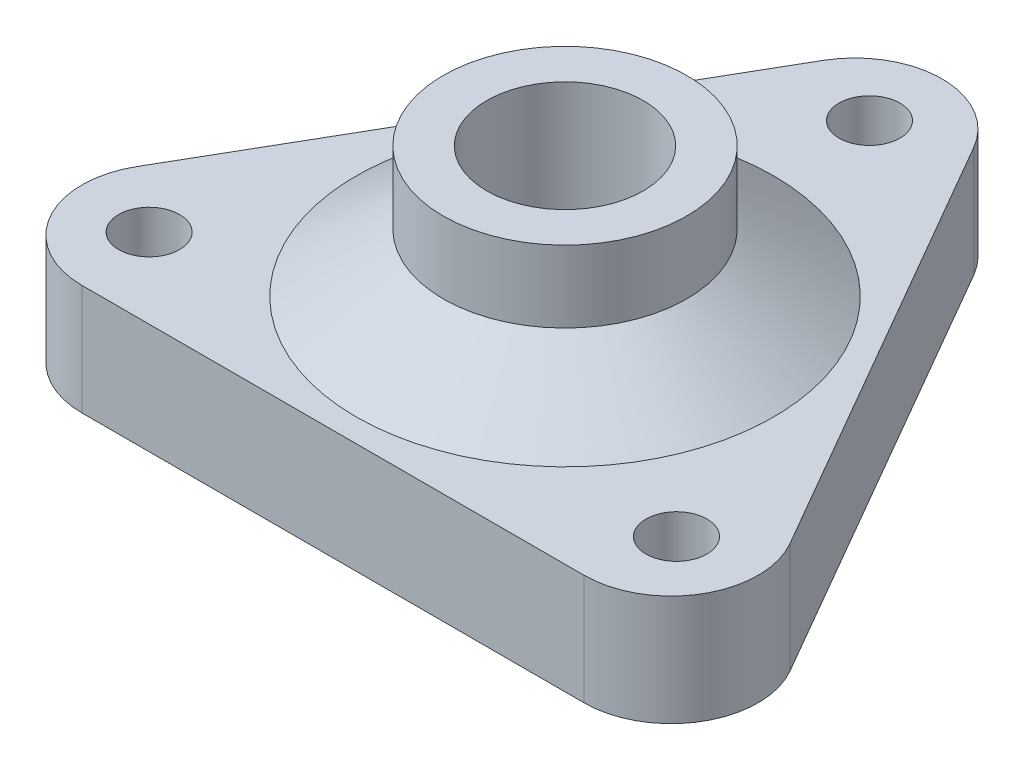
ISO-10303-21;
HEADER;
FILE_DESCRIPTION(('STEP AP214'),'2;1');
FILE_NAME('part.step','',(''),(''),'','','');
FILE_SCHEMA(('AUTOMOTIVE_DESIGN { 1 0 10303 214 1 1 1 1 }'));
ENDSEC;
DATA;
#1=APPLICATION_CONTEXT('core data for automotive mechanical design processes');
#2=APPLICATION_PROTOCOL_DEFINITION('international standard','automotive_design',2000,#1);
#3=PRODUCT_CONTEXT('',#1,'mechanical');
#4=PRODUCT('Part','Part','',(#3));
#5=PRODUCT_RELATED_PRODUCT_CATEGORY('part','',(#4));
#6=PRODUCT_DEFINITION_FORMATION('','',#4);
#7=PRODUCT_DEFINITION_CONTEXT('part definition',#1,'design');
#8=PRODUCT_DEFINITION('design','',#6,#7);
#9=PRODUCT_DEFINITION_SHAPE('','',#8);
#10=(LENGTH_UNIT() NAMED_UNIT(*) SI_UNIT(.MILLI.,.METRE.));
#11=(NAMED_UNIT(*) PLANE_ANGLE_UNIT() SI_UNIT($,.RADIAN.));
#12=(NAMED_UNIT(*) SI_UNIT($,.STERADIAN.) SOLID_ANGLE_UNIT());
#13=UNCERTAINTY_MEASURE_WITH_UNIT(LENGTH_MEASURE(1.E-05),#10,'distance_accuracy_value','');
#14=(GEOMETRIC_REPRESENTATION_CONTEXT(3) GLOBAL_UNCERTAINTY_ASSIGNED_CONTEXT((#13)) GLOBAL_UNIT_ASSIGNED_CONTEXT((#10,
#11,#12)) REPRESENTATION_CONTEXT('',''));
#15=CARTESIAN_POINT('',(0.,0.,0.));
#16=DIRECTION('',(0.,0.,1.));
#17=DIRECTION('',(1.,0.,0.));
#18=AXIS2_PLACEMENT_3D('',#15,#16,#17);
#19=CARTESIAN_POINT('',(0.,6.35,0.));
#20=DIRECTION('',(0.,1.,0.));
#21=DIRECTION('',(0.,0.,1.));
#22=AXIS2_PLACEMENT_3D('',#19,#20,#21);
#23=PLANE('',#22);
#24=CARTESIAN_POINT('',(0.,6.35,0.));
#25=DIRECTION('',(0.,1.,0.));
#26=DIRECTION('',(0.,0.,1.));
#27=AXIS2_PLACEMENT_3D('',#24,#25,#26);
#28=CIRCLE('',#27,12.);
#29=CARTESIAN_POINT('',(0.,6.35,12.));
#30=VERTEX_POINT('',#29);
#31=EDGE_CURVE('E11',#30,#30,#28,.F.);
#32=ORIENTED_EDGE('',*,*,#31,.T.);
#33=EDGE_LOOP('',(#32));
#34=FACE_BOUND('',#33,.T.);
#35=DIRECTION('',(-0.5,0.,-0.866025403784439));
#36=VECTOR('',#35,1.);
#37=CARTESIAN_POINT('',(11.5470053837925,6.35,-6.66666666666666));
#38=LINE('',#37,#36);
#39=CARTESIAN_POINT('',(18.7638837486628,6.35,5.83333333333334));
#40=VERTEX_POINT('',#39);
#41=CARTESIAN_POINT('',(4.33012701892218,6.35,-19.1666666666667));
#42=VERTEX_POINT('',#41);
#43=EDGE_CURVE('E249',#40,#42,#38,.T.);
#44=ORIENTED_EDGE('',*,*,#43,.T.);
#45=CARTESIAN_POINT('',(0.,6.35,-16.6666666666667));
#46=DIRECTION('',(0.,1.,0.));
#47=DIRECTION('',(0.,0.,1.));
#48=AXIS2_PLACEMENT_3D('',#45,#46,#47);
#49=CIRCLE('',#48,5.);
#50=CARTESIAN_POINT('',(-4.3301270189222,6.35,-19.1666666666667));
#51=VERTEX_POINT('',#50);
#52=EDGE_CURVE('E156',#42,#51,#49,.T.);
#53=ORIENTED_EDGE('',*,*,#52,.T.);
#54=DIRECTION('',(-0.5,0.,0.866025403784439));
#55=VECTOR('',#54,1.);
#56=CARTESIAN_POINT('',(-11.5470053837925,6.35,-6.66666666666667));
#57=LINE('',#56,#55);
#58=CARTESIAN_POINT('',(-18.7638837486628,6.35,5.83333333333333));
#59=VERTEX_POINT('',#58);
#60=EDGE_CURVE('E120',#51,#59,#57,.T.);
#61=ORIENTED_EDGE('',*,*,#60,.T.);
#62=CARTESIAN_POINT('',(-14.4337567297406,6.35,8.33333333333333));
#63=DIRECTION('',(0.,1.,0.));
#64=DIRECTION('',(0.,0.,1.));
#65=AXIS2_PLACEMENT_3D('',#62,#63,#64);
#66=CIRCLE('',#65,5.);
#67=CARTESIAN_POINT('',(-14.4337567297406,6.35,13.3333333333333));
#68=VERTEX_POINT('',#67);
#69=EDGE_CURVE('E67',#59,#68,#66,.T.);
#70=ORIENTED_EDGE('',*,*,#69,.T.);
#71=DIRECTION('',(1.,0.,0.));
#72=VECTOR('',#71,1.);
#73=CARTESIAN_POINT('',(0.,6.35,13.3333333333333));
#74=LINE('',#73,#72);
#75=CARTESIAN_POINT('',(14.4337567297406,6.35,13.3333333333333));
#76=VERTEX_POINT('',#75);
#77=EDGE_CURVE('E227',#68,#76,#74,.T.);
#78=ORIENTED_EDGE('',*,*,#77,.T.);
#79=CARTESIAN_POINT('',(14.4337567297406,6.35,8.33333333333333));
#80=DIRECTION('',(0.,1.,0.));
#81=DIRECTION('',(0.,0.,1.));
#82=AXIS2_PLACEMENT_3D('',#79,#80,#81);
#83=CIRCLE('',#82,5.);
#84=EDGE_CURVE('E153',#76,#40,#83,.T.);
#85=ORIENTED_EDGE('',*,*,#84,.T.);
#86=EDGE_LOOP('',(#44,#53,#61,#70,#78,#85));
#87=FACE_BOUND('',#86,.T.);
#88=CARTESIAN_POINT('',(-15.1554445662277,6.35,8.75));
#89=DIRECTION('',(0.,1.,0.));
#90=DIRECTION('',(0.,0.,1.));
#91=AXIS2_PLACEMENT_3D('',#88,#89,#90);
#92=CIRCLE('',#91,1.75);
#93=CARTESIAN_POINT('',(-15.1554445662277,6.35,10.5));
#94=VERTEX_POINT('',#93);
#95=EDGE_CURVE('E255',#94,#94,#92,.T.);
#96=ORIENTED_EDGE('',*,*,#95,.F.);
#97=EDGE_LOOP('',(#96));
#98=FACE_BOUND('',#97,.T.);
#99=CARTESIAN_POINT('',(0.,6.35,-17.5));
#100=DIRECTION('',(0.,1.,0.));
#101=DIRECTION('',(0.,0.,1.));
#102=AXIS2_PLACEMENT_3D('',#99,#100,#101);
#103=CIRCLE('',#102,1.75);
#104=CARTESIAN_POINT('',(0.,6.35,-15.75));
#105=VERTEX_POINT('',#104);
#106=EDGE_CURVE('E134',#105,#105,#103,.T.);
#107=ORIENTED_EDGE('',*,*,#106,.F.);
#108=EDGE_LOOP('',(#107));
#109=FACE_BOUND('',#108,.T.);
#110=CARTESIAN_POINT('',(15.1554445662277,6.35,8.75));
#111=DIRECTION('',(0.,1.,0.));
#112=DIRECTION('',(0.,0.,1.));
#113=AXIS2_PLACEMENT_3D('',#110,#111,#112);
#114=CIRCLE('',#113,1.75);
#115=CARTESIAN_POINT('',(15.1554445662277,6.35,10.5));
#116=VERTEX_POINT('',#115);
#117=EDGE_CURVE('E128',#116,#116,#114,.T.);
#118=ORIENTED_EDGE('',*,*,#117,.F.);
#119=EDGE_LOOP('',(#118));
#120=FACE_BOUND('',#119,.T.);
#121=ADVANCED_FACE('F43',(#34,#87,#98,#109,#120),#23,.T.);
#122=CARTESIAN_POINT('',(0.,6.35,13.3333333333333));
#123=DIRECTION('',(0.,0.,-1.));
#124=DIRECTION('',(-1.,0.,0.));
#125=AXIS2_PLACEMENT_3D('',#122,#123,#124);
#126=PLANE('',#125);
#127=DIRECTION('',(1.,0.,0.));
#128=VECTOR('',#127,1.);
#129=CARTESIAN_POINT('',(0.,0.,13.3333333333333));
#130=LINE('',#129,#128);
#131=CARTESIAN_POINT('',(-14.4337567297406,0.,13.3333333333333));
#132=VERTEX_POINT('',#131);
#133=CARTESIAN_POINT('',(14.4337567297406,0.,13.3333333333333));
#134=VERTEX_POINT('',#133);
#135=EDGE_CURVE('E136',#132,#134,#130,.T.);
#136=ORIENTED_EDGE('',*,*,#135,.T.);
#137=DIRECTION('',(0.,-1.,0.));
#138=VECTOR('',#137,1.);
#139=CARTESIAN_POINT('',(14.4337567297406,6.35,13.3333333333333));
#140=LINE('',#139,#138);
#141=EDGE_CURVE('E60',#134,#76,#140,.F.);
#142=ORIENTED_EDGE('',*,*,#141,.T.);
#143=ORIENTED_EDGE('',*,*,#77,.F.);
#144=DIRECTION('',(0.,-1.,0.));
#145=VECTOR('',#144,1.);
#146=CARTESIAN_POINT('',(-14.4337567297406,6.35,13.3333333333333));
#147=LINE('',#146,#145);
#148=EDGE_CURVE('E159',#68,#132,#147,.T.);
#149=ORIENTED_EDGE('',*,*,#148,.T.);
#150=EDGE_LOOP('',(#136,#142,#143,#149));
#151=FACE_BOUND('',#150,.T.);
#152=ADVANCED_FACE('F180',(#151),#126,.F.);
#153=CARTESIAN_POINT('',(11.5470053837925,6.35,-6.66666666666666));
#154=DIRECTION('',(-0.866025403784439,0.,0.5));
#155=DIRECTION('',(0.5,0.,0.866025403784439));
#156=AXIS2_PLACEMENT_3D('',#153,#154,#155);
#157=PLANE('',#156);
#158=DIRECTION('',(-0.5,0.,-0.866025403784439));
#159=VECTOR('',#158,1.);
#160=CARTESIAN_POINT('',(11.5470053837925,0.,-6.66666666666666));
#161=LINE('',#160,#159);
#162=CARTESIAN_POINT('',(18.7638837486628,0.,5.83333333333334));
#163=VERTEX_POINT('',#162);
#164=CARTESIAN_POINT('',(4.33012701892218,0.,-19.1666666666667));
#165=VERTEX_POINT('',#164);
#166=EDGE_CURVE('E129',#163,#165,#161,.T.);
#167=ORIENTED_EDGE('',*,*,#166,.T.);
#168=DIRECTION('',(0.,-1.,0.));
#169=VECTOR('',#168,1.);
#170=CARTESIAN_POINT('',(4.33012701892219,6.35,-19.1666666666667));
#171=LINE('',#170,#169);
#172=EDGE_CURVE('E105',#165,#42,#171,.F.);
#173=ORIENTED_EDGE('',*,*,#172,.T.);
#174=ORIENTED_EDGE('',*,*,#43,.F.);
#175=DIRECTION('',(0.,-1.,0.));
#176=VECTOR('',#175,1.);
#177=CARTESIAN_POINT('',(18.7638837486628,6.35,5.83333333333333));
#178=LINE('',#177,#176);
#179=EDGE_CURVE('E111',#40,#163,#178,.T.);
#180=ORIENTED_EDGE('',*,*,#179,.T.);
#181=EDGE_LOOP('',(#167,#173,#174,#180));
#182=FACE_BOUND('',#181,.T.);
#183=ADVANCED_FACE('F186',(#182),#157,.F.);
#184=CARTESIAN_POINT('',(0.,6.35,0.));
#185=DIRECTION('',(0.,-1.,0.));
#186=DIRECTION('',(0.,0.,-1.));
#187=AXIS2_PLACEMENT_3D('',#184,#185,#186);
#188=CYLINDRICAL_SURFACE('',#187,4.5);
#189=CARTESIAN_POINT('',(0.,0.,0.));
#190=DIRECTION('',(0.,1.,0.));
#191=DIRECTION('',(0.,0.,1.));
#192=AXIS2_PLACEMENT_3D('',#189,#190,#191);
#193=CIRCLE('',#192,4.5);
#194=CARTESIAN_POINT('',(0.,0.,4.5));
#195=VERTEX_POINT('',#194);
#196=EDGE_CURVE('E229',#195,#195,#193,.T.);
#197=ORIENTED_EDGE('',*,*,#196,.F.);
#198=EDGE_LOOP('',(#197));
#199=FACE_BOUND('',#198,.T.);
#200=CARTESIAN_POINT('',(0.,13.85,0.));
#201=DIRECTION('',(0.,1.,0.));
#202=DIRECTION('',(0.,0.,1.));
#203=AXIS2_PLACEMENT_3D('',#200,#201,#202);
#204=CIRCLE('',#203,4.5);
#205=CARTESIAN_POINT('',(0.,13.85,4.5));
#206=VERTEX_POINT('',#205);
#207=EDGE_CURVE('E265',#206,#206,#204,.T.);
#208=ORIENTED_EDGE('',*,*,#207,.T.);
#209=EDGE_LOOP('',(#208));
#210=FACE_BOUND('',#209,.T.);
#211=ADVANCED_FACE('F197',(#199,#210),#188,.F.);
#212=CARTESIAN_POINT('',(-15.1554445662277,6.35,8.75));
#213=DIRECTION('',(0.,-1.,0.));
#214=DIRECTION('',(0.,0.,-1.));
#215=AXIS2_PLACEMENT_3D('',#212,#213,#214);
#216=CYLINDRICAL_SURFACE('',#215,1.75);
#217=ORIENTED_EDGE('',*,*,#95,.T.);
#218=EDGE_LOOP('',(#217));
#219=FACE_BOUND('',#218,.T.);
#220=CARTESIAN_POINT('',(-15.1554445662277,0.,8.75));
#221=DIRECTION('',(0.,1.,0.));
#222=DIRECTION('',(0.,0.,1.));
#223=AXIS2_PLACEMENT_3D('',#220,#221,#222);
#224=CIRCLE('',#223,1.75);
#225=CARTESIAN_POINT('',(-15.1554445662277,0.,10.5));
#226=VERTEX_POINT('',#225);
#227=EDGE_CURVE('E232',#226,#226,#224,.T.);
#228=ORIENTED_EDGE('',*,*,#227,.F.);
#229=EDGE_LOOP('',(#228));
#230=FACE_BOUND('',#229,.T.);
#231=ADVANCED_FACE('F202',(#219,#230),#216,.F.);
#232=CARTESIAN_POINT('',(0.,6.35,-17.5));
#233=DIRECTION('',(0.,-1.,0.));
#234=DIRECTION('',(0.,0.,-1.));
#235=AXIS2_PLACEMENT_3D('',#232,#233,#234);
#236=CYLINDRICAL_SURFACE('',#235,1.75);
#237=ORIENTED_EDGE('',*,*,#106,.T.);
#238=EDGE_LOOP('',(#237));
#239=FACE_BOUND('',#238,.T.);
#240=CARTESIAN_POINT('',(0.,0.,-17.5));
#241=DIRECTION('',(0.,1.,0.));
#242=DIRECTION('',(0.,0.,1.));
#243=AXIS2_PLACEMENT_3D('',#240,#241,#242);
#244=CIRCLE('',#243,1.75);
#245=CARTESIAN_POINT('',(0.,0.,-15.75));
#246=VERTEX_POINT('',#245);
#247=EDGE_CURVE('E238',#246,#246,#244,.T.);
#248=ORIENTED_EDGE('',*,*,#247,.F.);
#249=EDGE_LOOP('',(#248));
#250=FACE_BOUND('',#249,.T.);
#251=ADVANCED_FACE('F206',(#239,#250),#236,.F.);
#252=CARTESIAN_POINT('',(15.1554445662277,6.35,8.75));
#253=DIRECTION('',(0.,-1.,0.));
#254=DIRECTION('',(0.,0.,-1.));
#255=AXIS2_PLACEMENT_3D('',#252,#253,#254);
#256=CYLINDRICAL_SURFACE('',#255,1.75);
#257=ORIENTED_EDGE('',*,*,#117,.T.);
#258=EDGE_LOOP('',(#257));
#259=FACE_BOUND('',#258,.T.);
#260=CARTESIAN_POINT('',(15.1554445662277,0.,8.75));
#261=DIRECTION('',(0.,1.,0.));
#262=DIRECTION('',(0.,0.,1.));
#263=AXIS2_PLACEMENT_3D('',#260,#261,#262);
#264=CIRCLE('',#263,1.75);
#265=CARTESIAN_POINT('',(15.1554445662277,0.,10.5));
#266=VERTEX_POINT('',#265);
#267=EDGE_CURVE('E242',#266,#266,#264,.T.);
#268=ORIENTED_EDGE('',*,*,#267,.F.);
#269=EDGE_LOOP('',(#268));
#270=FACE_BOUND('',#269,.T.);
#271=ADVANCED_FACE('F195',(#259,#270),#256,.F.);
#272=CARTESIAN_POINT('',(-11.5470053837925,6.35,-6.66666666666667));
#273=DIRECTION('',(0.866025403784439,0.,0.5));
#274=DIRECTION('',(0.5,0.,-0.866025403784439));
#275=AXIS2_PLACEMENT_3D('',#272,#273,#274);
#276=PLANE('',#275);
#277=ORIENTED_EDGE('',*,*,#60,.F.);
#278=DIRECTION('',(0.,-1.,0.));
#279=VECTOR('',#278,1.);
#280=CARTESIAN_POINT('',(-4.3301270189222,6.35,-19.1666666666667));
#281=LINE('',#280,#279);
#282=CARTESIAN_POINT('',(-4.3301270189222,0.,-19.1666666666667));
#283=VERTEX_POINT('',#282);
#284=EDGE_CURVE('E104',#51,#283,#281,.T.);
#285=ORIENTED_EDGE('',*,*,#284,.T.);
#286=DIRECTION('',(-0.5,0.,0.866025403784439));
#287=VECTOR('',#286,1.);
#288=CARTESIAN_POINT('',(-11.5470053837925,0.,-6.66666666666667));
#289=LINE('',#288,#287);
#290=CARTESIAN_POINT('',(-18.7638837486628,0.,5.83333333333333));
#291=VERTEX_POINT('',#290);
#292=EDGE_CURVE('E118',#283,#291,#289,.T.);
#293=ORIENTED_EDGE('',*,*,#292,.T.);
#294=DIRECTION('',(0.,-1.,0.));
#295=VECTOR('',#294,1.);
#296=CARTESIAN_POINT('',(-18.7638837486628,6.35,5.83333333333333));
#297=LINE('',#296,#295);
#298=EDGE_CURVE('E123',#291,#59,#297,.F.);
#299=ORIENTED_EDGE('',*,*,#298,.T.);
#300=EDGE_LOOP('',(#277,#285,#293,#299));
#301=FACE_BOUND('',#300,.T.);
#302=ADVANCED_FACE('F117',(#301),#276,.F.);
#303=CARTESIAN_POINT('',(0.,0.,0.));
#304=DIRECTION('',(0.,1.,0.));
#305=DIRECTION('',(0.,0.,1.));
#306=AXIS2_PLACEMENT_3D('',#303,#304,#305);
#307=PLANE('',#306);
#308=ORIENTED_EDGE('',*,*,#267,.T.);
#309=EDGE_LOOP('',(#308));
#310=FACE_BOUND('',#309,.T.);
#311=ORIENTED_EDGE('',*,*,#247,.T.);
#312=EDGE_LOOP('',(#311));
#313=FACE_BOUND('',#312,.T.);
#314=ORIENTED_EDGE('',*,*,#227,.T.);
#315=EDGE_LOOP('',(#314));
#316=FACE_BOUND('',#315,.T.);
#317=ORIENTED_EDGE('',*,*,#196,.T.);
#318=EDGE_LOOP('',(#317));
#319=FACE_BOUND('',#318,.T.);
#320=ORIENTED_EDGE('',*,*,#292,.F.);
#321=CARTESIAN_POINT('',(0.,0.,-16.6666666666667));
#322=DIRECTION('',(0.,1.,0.));
#323=DIRECTION('',(0.,0.,1.));
#324=AXIS2_PLACEMENT_3D('',#321,#322,#323);
#325=CIRCLE('',#324,5.);
#326=EDGE_CURVE('E100',#283,#165,#325,.F.);
#327=ORIENTED_EDGE('',*,*,#326,.T.);
#328=ORIENTED_EDGE('',*,*,#166,.F.);
#329=CARTESIAN_POINT('',(14.4337567297406,0.,8.33333333333333));
#330=DIRECTION('',(0.,1.,0.));
#331=DIRECTION('',(0.,0.,1.));
#332=AXIS2_PLACEMENT_3D('',#329,#330,#331);
#333=CIRCLE('',#332,5.);
#334=EDGE_CURVE('E112',#163,#134,#333,.F.);
#335=ORIENTED_EDGE('',*,*,#334,.T.);
#336=ORIENTED_EDGE('',*,*,#135,.F.);
#337=CARTESIAN_POINT('',(-14.4337567297406,0.,8.33333333333333));
#338=DIRECTION('',(0.,1.,0.));
#339=DIRECTION('',(0.,0.,1.));
#340=AXIS2_PLACEMENT_3D('',#337,#338,#339);
#341=CIRCLE('',#340,5.);
#342=EDGE_CURVE('E122',#132,#291,#341,.F.);
#343=ORIENTED_EDGE('',*,*,#342,.T.);
#344=EDGE_LOOP('',(#320,#327,#328,#335,#336,#343));
#345=FACE_BOUND('',#344,.T.);
#346=ADVANCED_FACE('F125',(#310,#313,#316,#319,#345),#307,.F.);
#347=CARTESIAN_POINT('',(0.,6.35,-16.6666666666667));
#348=DIRECTION('',(0.,-1.,0.));
#349=DIRECTION('',(0.,0.,-1.));
#350=AXIS2_PLACEMENT_3D('',#347,#348,#349);
#351=CYLINDRICAL_SURFACE('',#350,5.);
#352=ORIENTED_EDGE('',*,*,#52,.F.);
#353=ORIENTED_EDGE('',*,*,#172,.F.);
#354=ORIENTED_EDGE('',*,*,#326,.F.);
#355=ORIENTED_EDGE('',*,*,#284,.F.);
#356=EDGE_LOOP('',(#352,#353,#354,#355));
#357=FACE_BOUND('',#356,.T.);
#358=ADVANCED_FACE('F103',(#357),#351,.T.);
#359=CARTESIAN_POINT('',(14.4337567297406,6.35,8.33333333333333));
#360=DIRECTION('',(0.,-1.,0.));
#361=DIRECTION('',(0.,0.,-1.));
#362=AXIS2_PLACEMENT_3D('',#359,#360,#361);
#363=CYLINDRICAL_SURFACE('',#362,5.);
#364=ORIENTED_EDGE('',*,*,#84,.F.);
#365=ORIENTED_EDGE('',*,*,#141,.F.);
#366=ORIENTED_EDGE('',*,*,#334,.F.);
#367=ORIENTED_EDGE('',*,*,#179,.F.);
#368=EDGE_LOOP('',(#364,#365,#366,#367));
#369=FACE_BOUND('',#368,.T.);
#370=ADVANCED_FACE('F216',(#369),#363,.T.);
#371=CARTESIAN_POINT('',(-14.4337567297406,6.35,8.33333333333333));
#372=DIRECTION('',(0.,-1.,0.));
#373=DIRECTION('',(0.,0.,-1.));
#374=AXIS2_PLACEMENT_3D('',#371,#372,#373);
#375=CYLINDRICAL_SURFACE('',#374,5.);
#376=ORIENTED_EDGE('',*,*,#69,.F.);
#377=ORIENTED_EDGE('',*,*,#298,.F.);
#378=ORIENTED_EDGE('',*,*,#342,.F.);
#379=ORIENTED_EDGE('',*,*,#148,.F.);
#380=EDGE_LOOP('',(#376,#377,#378,#379));
#381=FACE_BOUND('',#380,.T.);
#382=ADVANCED_FACE('F218',(#381),#375,.T.);
#383=CARTESIAN_POINT('',(0.,13.85,0.));
#384=DIRECTION('',(0.,1.,0.));
#385=DIRECTION('',(0.,0.,1.));
#386=AXIS2_PLACEMENT_3D('',#383,#384,#385);
#387=PLANE('',#386);
#388=CARTESIAN_POINT('',(0.,13.85,0.));
#389=DIRECTION('',(0.,1.,0.));
#390=DIRECTION('',(0.,0.,1.));
#391=AXIS2_PLACEMENT_3D('',#388,#389,#390);
#392=CIRCLE('',#391,7.);
#393=CARTESIAN_POINT('',(0.,13.85,7.));
#394=VERTEX_POINT('',#393);
#395=EDGE_CURVE('E246',#394,#394,#392,.T.);
#396=ORIENTED_EDGE('',*,*,#395,.T.);
#397=EDGE_LOOP('',(#396));
#398=FACE_BOUND('',#397,.T.);
#399=ORIENTED_EDGE('',*,*,#207,.F.);
#400=EDGE_LOOP('',(#399));
#401=FACE_BOUND('',#400,.T.);
#402=ADVANCED_FACE('F176',(#398,#401),#387,.T.);
#403=CARTESIAN_POINT('',(0.,13.85,0.));
#404=DIRECTION('',(0.,-1.,0.));
#405=DIRECTION('',(0.,0.,-1.));
#406=AXIS2_PLACEMENT_3D('',#403,#404,#405);
#407=CYLINDRICAL_SURFACE('',#406,7.);
#408=CARTESIAN_POINT('',(0.,9.72254258421215,0.));
#409=DIRECTION('',(0.,1.,0.));
#410=DIRECTION('',(0.,0.,1.));
#411=AXIS2_PLACEMENT_3D('',#408,#409,#410);
#412=CIRCLE('',#411,7.);
#413=CARTESIAN_POINT('',(0.,9.72254258421215,7.));
#414=VERTEX_POINT('',#413);
#415=EDGE_CURVE('E53',#414,#414,#412,.T.);
#416=ORIENTED_EDGE('',*,*,#415,.T.);
#417=EDGE_LOOP('',(#416));
#418=FACE_BOUND('',#417,.T.);
#419=ORIENTED_EDGE('',*,*,#395,.F.);
#420=EDGE_LOOP('',(#419));
#421=FACE_BOUND('',#420,.T.);
#422=ADVANCED_FACE('F168',(#418,#421),#407,.T.);
#423=CARTESIAN_POINT('',(0.,9.72254258421215,0.));
#424=DIRECTION('',(0.,-1.,0.));
#425=DIRECTION('',(0.,0.,-1.));
#426=AXIS2_PLACEMENT_3D('',#423,#424,#425);
#427=CONICAL_SURFACE('',#426,7.,0.977384381116819);
#428=ORIENTED_EDGE('',*,*,#31,.F.);
#429=EDGE_LOOP('',(#428));
#430=FACE_BOUND('',#429,.T.);
#431=ORIENTED_EDGE('',*,*,#415,.F.);
#432=EDGE_LOOP('',(#431));
#433=FACE_BOUND('',#432,.T.);
#434=ADVANCED_FACE('F46',(#430,#433),#427,.T.);
#435=CLOSED_SHELL('',(#121,#152,#183,#211,#231,#251,#271,#302,#346,#358,#370,#382,#402,#422,#434));
#436=MANIFOLD_SOLID_BREP('B2',#435);
#437=ADVANCED_BREP_SHAPE_REPRESENTATION('',(#18,#436),#14);
#438=SHAPE_DEFINITION_REPRESENTATION(#9,#437);
ENDSEC;
END-ISO-10303-21;
